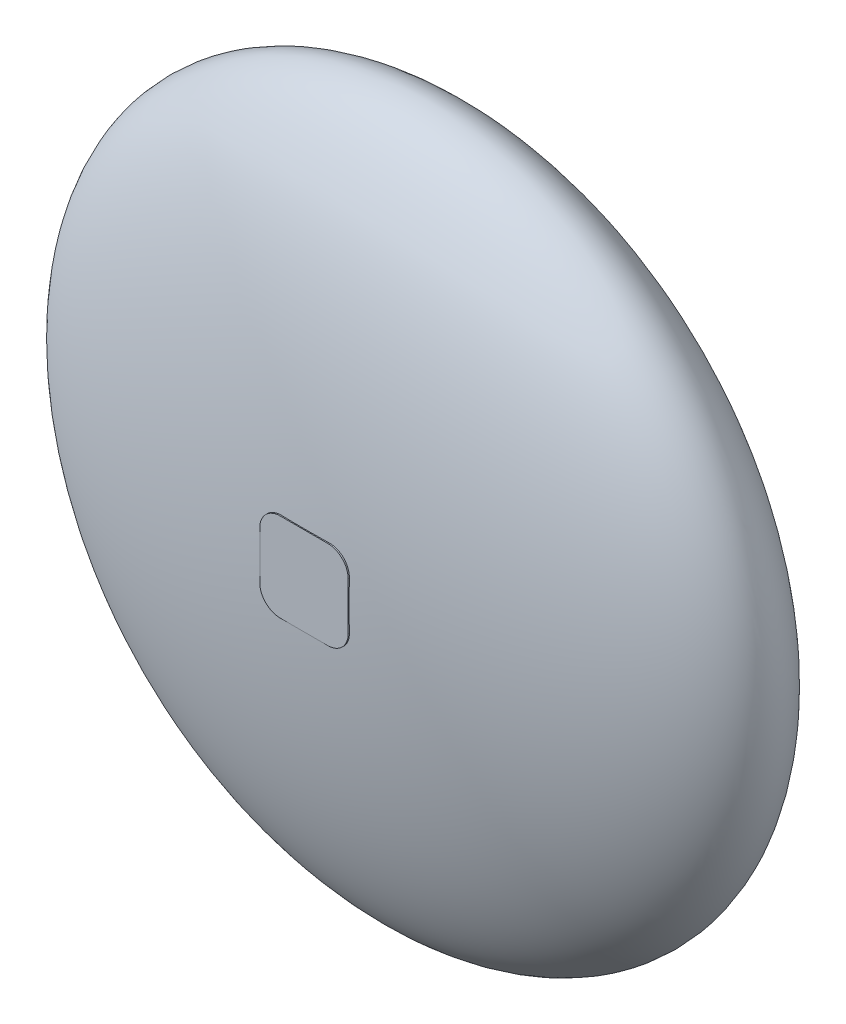
ISO-10303-21;
HEADER;
FILE_DESCRIPTION(('STEP AP214'),'2;1');
FILE_NAME('part.step','',(''),(''),'','','');
FILE_SCHEMA(('AUTOMOTIVE_DESIGN { 1 0 10303 214 1 1 1 1 }'));
ENDSEC;
DATA;
#1=APPLICATION_CONTEXT('core data for automotive mechanical design processes');
#2=APPLICATION_PROTOCOL_DEFINITION('international standard','automotive_design',2000,#1);
#3=PRODUCT_CONTEXT('',#1,'mechanical');
#4=PRODUCT('Part','Part','',(#3));
#5=PRODUCT_RELATED_PRODUCT_CATEGORY('part','',(#4));
#6=PRODUCT_DEFINITION_FORMATION('','',#4);
#7=PRODUCT_DEFINITION_CONTEXT('part definition',#1,'design');
#8=PRODUCT_DEFINITION('design','',#6,#7);
#9=PRODUCT_DEFINITION_SHAPE('','',#8);
#10=(LENGTH_UNIT() NAMED_UNIT(*) SI_UNIT(.MILLI.,.METRE.));
#11=(NAMED_UNIT(*) PLANE_ANGLE_UNIT() SI_UNIT($,.RADIAN.));
#12=(NAMED_UNIT(*) SI_UNIT($,.STERADIAN.) SOLID_ANGLE_UNIT());
#13=UNCERTAINTY_MEASURE_WITH_UNIT(LENGTH_MEASURE(1.E-05),#10,'distance_accuracy_value','');
#14=(GEOMETRIC_REPRESENTATION_CONTEXT(3) GLOBAL_UNCERTAINTY_ASSIGNED_CONTEXT((#13)) GLOBAL_UNIT_ASSIGNED_CONTEXT((#10,
#11,#12)) REPRESENTATION_CONTEXT('',''));
#15=CARTESIAN_POINT('',(0.,0.,0.));
#16=DIRECTION('',(0.,0.,1.));
#17=DIRECTION('',(1.,0.,0.));
#18=AXIS2_PLACEMENT_3D('',#15,#16,#17);
#19=CARTESIAN_POINT('',(0.,0.,0.));
#20=DIRECTION('',(0.,1.,0.));
#21=DIRECTION('',(-1.,0.,0.));
#22=AXIS2_PLACEMENT_3D('',#19,#20,#21);
#23=ELLIPSE('',#22,52.5,17.5);
#24=TRIMMED_CURVE('',#23,(PARAMETER_VALUE(1.5707963267949)),(PARAMETER_VALUE(4.71238898038469)),
.T.,.PARAMETER.);
#25=CARTESIAN_POINT('',(0.,0.,-17.5));
#26=DIRECTION('',(0.,0.,-1.));
#27=AXIS1_PLACEMENT('',#25,#26);
#28=SURFACE_OF_REVOLUTION('',#24,#27);
#29=CARTESIAN_POINT('',(0.,0.,-17.5));
#30=VERTEX_POINT('',#29);
#31=VERTEX_LOOP('',#30);
#32=FACE_BOUND('',#31,.T.);
#33=CARTESIAN_POINT('',(-6.5,6.5,17.2296578930375));
#34=CARTESIAN_POINT('',(-6.5,6.06673915113738,17.2478179504002));
#35=CARTESIAN_POINT('',(-6.5,5.63340143215986,17.2641388809829));
#36=CARTESIAN_POINT('',(-6.5,4.76672510889701,17.2931201536714));
#37=CARTESIAN_POINT('',(-6.5,4.33338653887092,17.3057815200269));
#38=CARTESIAN_POINT('',(-6.5,3.46670916694604,17.3274692129494));
#39=CARTESIAN_POINT('',(-6.5,3.03337038403128,17.3364962988253));
#40=CARTESIAN_POINT('',(-6.5,2.16669286962265,17.3509323271832));
#41=CARTESIAN_POINT('',(-6.5,1.73335414650458,17.3563417727258));
#42=CARTESIAN_POINT('',(-6.5,0.866676947528741,17.3635530016783));
#43=CARTESIAN_POINT('',(-6.5,0.433338473764371,17.3653550368415));
#44=CARTESIAN_POINT('',(-6.5,-0.433338473764368,17.3653550368415));
#45=CARTESIAN_POINT('',(-6.5,-0.866676947528738,17.3635530016783));
#46=CARTESIAN_POINT('',(-6.5,-1.73335414650458,17.3563417727258));
#47=CARTESIAN_POINT('',(-6.5,-2.16669286962265,17.3509323271832));
#48=CARTESIAN_POINT('',(-6.5,-3.03337038403128,17.3364962988253));
#49=CARTESIAN_POINT('',(-6.5,-3.46670916694603,17.3274692129494));
#50=CARTESIAN_POINT('',(-6.5,-4.33338653887092,17.3057815200269));
#51=CARTESIAN_POINT('',(-6.5,-4.76672510889701,17.2931201536714));
#52=CARTESIAN_POINT('',(-6.5,-5.63340143215985,17.2641388809829));
#53=CARTESIAN_POINT('',(-6.5,-6.06673915113738,17.2478179504002));
#54=CARTESIAN_POINT('',(-6.5,-6.49999999999999,17.2296578930375));
#55=B_SPLINE_CURVE_WITH_KNOTS('',3,(#33,#34,#35,#36,#37,#38,#39,#40,#41,#42,#43,#44,#45,#46,#47,
#48,#49,#50,#51,#52,#53,#54),.UNSPECIFIED.,.F.,.F.,(4,2,2,2,2,2,2,2,2,2,4),(0.,1.3009195823563,
2.60147470608828,3.90175796415447,5.20186037031147,6.50187204200393,7.80188371369638,
9.10198611985339,10.4022693779196,11.7028245016516,13.0037440840079),.UNSPECIFIED.);
#56=CARTESIAN_POINT('',(-6.5,3.5,17.326120294066));
#57=VERTEX_POINT('',#56);
#58=CARTESIAN_POINT('',(-6.5,-3.5,17.326120294066));
#59=VERTEX_POINT('',#58);
#60=EDGE_CURVE('E195',#57,#59,#55,.T.);
#61=ORIENTED_EDGE('',*,*,#60,.F.);
#62=CARTESIAN_POINT('',(-6.50000000000001,3.50000000000001,17.3261202940657));
#63=CARTESIAN_POINT('',(-6.50000808201307,3.58434884798788,17.3242268826554));
#64=CARTESIAN_POINT('',(-6.49644266273658,3.66869573952322,17.3224134129366));
#65=CARTESIAN_POINT('',(-6.4822264240845,3.83679011726138,17.3189584979342));
#66=CARTESIAN_POINT('',(-6.47157592798171,3.92053763063599,17.3173170448059));
#67=CARTESIAN_POINT('',(-6.44326163821618,4.08678385219233,17.3142192789836));
#68=CARTESIAN_POINT('',(-6.42560305528571,4.1692834410394,17.3127628297931));
#69=CARTESIAN_POINT('',(-6.38341504311973,4.33248509376793,17.3100443404612));
#70=CARTESIAN_POINT('',(-6.35888570223373,4.41318718074865,17.3087822978203));
#71=CARTESIAN_POINT('',(-6.27518790816895,4.65182008917852,17.3053010278226));
#72=CARTESIAN_POINT('',(-6.20589843033987,4.80634328802381,17.3033854347017));
#73=CARTESIAN_POINT('',(-6.04240542281534,5.1014577111456,17.3004270271699));
#74=CARTESIAN_POINT('',(-5.94820641467615,5.24205145752367,17.2993840545046));
#75=CARTESIAN_POINT('',(-5.73756561493316,5.50541975629821,17.2981987040124));
#76=CARTESIAN_POINT('',(-5.62113020388941,5.62819940256874,17.2980560682398));
#77=CARTESIAN_POINT('',(-5.36928193836722,5.85249372873365,17.2986755149767));
#78=CARTESIAN_POINT('',(-5.23386540750456,5.9540042795691,17.299437772966));
#79=CARTESIAN_POINT('',(-4.94792670797271,6.13286105532747,17.3018447910835));
#80=CARTESIAN_POINT('',(-4.79740346105683,6.21020555376777,17.3034896142415));
#81=CARTESIAN_POINT('',(-4.4855520591393,6.33849827075239,17.3076145274679));
#82=CARTESIAN_POINT('',(-4.32423020689434,6.38946173783651,17.3100941336511));
#83=CARTESIAN_POINT('',(-4.05160835155083,6.45094454681752,17.3148368024317));
#84=CARTESIAN_POINT('',(-3.94201367352901,6.46932964167806,17.3168852743214));
#85=CARTESIAN_POINT('',(-3.72162682968406,6.49385585453891,17.3212831979293));
#86=CARTESIAN_POINT('',(-3.61083658716706,6.50001433715969,17.3236322177419));
#87=CARTESIAN_POINT('',(-3.5,6.5,17.326120294066));
#88=B_SPLINE_CURVE_WITH_KNOTS('',3,(#62,#63,#64,#65,#66,#67,#68,#69,#70,#71,#72,#73,#74,#75,#76,
#77,#78,#79,#80,#81,#82,#83,#84,#85,#86,#87),.UNSPECIFIED.,.F.,.F.,(4,2,2,2,2,2,2,2,2,2,2,2,4),
(0.,0.25302815046839,0.506044756740944,0.758873588634506,1.01169916960884,1.51715276012559,
2.0225146640521,2.52773177566137,3.033046876503,3.53839807005597,4.04345683771944,
4.37625598085183,4.70858213305575),.UNSPECIFIED.);
#89=CARTESIAN_POINT('',(-3.5,6.5,17.326120294066));
#90=VERTEX_POINT('',#89);
#91=EDGE_CURVE('E60',#57,#90,#88,.T.);
#92=ORIENTED_EDGE('',*,*,#91,.T.);
#93=CARTESIAN_POINT('',(6.50000000000002,6.50000000000001,17.2296578930375));
#94=CARTESIAN_POINT('',(6.0667391511374,6.50000000000001,17.2478179504002));
#95=CARTESIAN_POINT('',(5.63340143215988,6.5,17.2641388809829));
#96=CARTESIAN_POINT('',(4.76672510889703,6.5,17.2931201536714));
#97=CARTESIAN_POINT('',(4.33338653887094,6.5,17.3057815200269));
#98=CARTESIAN_POINT('',(3.46670916694605,6.5,17.3274692129494));
#99=CARTESIAN_POINT('',(3.0333703840313,6.5,17.3364962988253));
#100=CARTESIAN_POINT('',(2.16669286962266,6.5,17.3509323271832));
#101=CARTESIAN_POINT('',(1.73335414650459,6.5,17.3563417727258));
#102=CARTESIAN_POINT('',(0.86667694752875,6.5,17.3635530016783));
#103=CARTESIAN_POINT('',(0.43333847376438,6.5,17.3653550368415));
#104=CARTESIAN_POINT('',(-0.433338473764362,6.5,17.3653550368415));
#105=CARTESIAN_POINT('',(-0.866676947528733,6.5,17.3635530016783));
#106=CARTESIAN_POINT('',(-1.73335414650457,6.5,17.3563417727258));
#107=CARTESIAN_POINT('',(-2.16669286962264,6.5,17.3509323271832));
#108=CARTESIAN_POINT('',(-3.03337038403128,6.5,17.3364962988253));
#109=CARTESIAN_POINT('',(-3.46670916694603,6.5,17.3274692129494));
#110=CARTESIAN_POINT('',(-4.33338653887092,6.5,17.3057815200269));
#111=CARTESIAN_POINT('',(-4.76672510889701,6.5,17.2931201536714));
#112=CARTESIAN_POINT('',(-5.63340143215986,6.5,17.2641388809829));
#113=CARTESIAN_POINT('',(-6.06673915113739,6.5,17.2478179504002));
#114=CARTESIAN_POINT('',(-6.5,6.5,17.2296578930375));
#115=B_SPLINE_CURVE_WITH_KNOTS('',3,(#93,#94,#95,#96,#97,#98,#99,#100,#101,#102,#103,#104,#105,
#106,#107,#108,#109,#110,#111,#112,#113,#114),.UNSPECIFIED.,.F.,.F.,(4,2,2,2,2,2,2,2,2,2,4),(0.,
1.3009195823563,2.60147470608829,3.90175796415448,5.20186037031149,6.50187204200394,
7.8018837136964,9.10198611985341,10.4022693779196,11.7028245016516,13.0037440840079),.UNSPECIFIED.);
#116=CARTESIAN_POINT('',(3.5,6.50000000000001,17.326120294066));
#117=VERTEX_POINT('',#116);
#118=EDGE_CURVE('E188',#117,#90,#115,.T.);
#119=ORIENTED_EDGE('',*,*,#118,.F.);
#120=CARTESIAN_POINT('',(3.5,6.5,17.326120294066));
#121=CARTESIAN_POINT('',(3.58434884798787,6.50000808201306,17.3242268826554));
#122=CARTESIAN_POINT('',(3.66869573952321,6.49644266273658,17.3224134129366));
#123=CARTESIAN_POINT('',(3.83679011726137,6.4822264240845,17.3189584979342));
#124=CARTESIAN_POINT('',(3.92053763063598,6.47157592798172,17.3173170448059));
#125=CARTESIAN_POINT('',(4.08678385219233,6.44326163821618,17.3142192789837));
#126=CARTESIAN_POINT('',(4.1692834410394,6.42560305528572,17.3127628297931));
#127=CARTESIAN_POINT('',(4.33248509376792,6.38341504311973,17.3100443404612));
#128=CARTESIAN_POINT('',(4.41318718074864,6.35888570223374,17.3087822978203));
#129=CARTESIAN_POINT('',(4.65182008917851,6.27518790816896,17.3053010278226));
#130=CARTESIAN_POINT('',(4.80634328802381,6.20589843033988,17.3033854347017));
#131=CARTESIAN_POINT('',(5.10145771114559,6.04240542281534,17.3004270271699));
#132=CARTESIAN_POINT('',(5.24205145752366,5.94820641467615,17.2993840545046));
#133=CARTESIAN_POINT('',(5.5054197562982,5.73756561493316,17.2981987040124));
#134=CARTESIAN_POINT('',(5.62819940256874,5.62113020388942,17.2980560682398));
#135=CARTESIAN_POINT('',(5.85249372873364,5.36928193836722,17.2986755149767));
#136=CARTESIAN_POINT('',(5.9540042795691,5.23386540750456,17.299437772966));
#137=CARTESIAN_POINT('',(6.13286105532746,4.94792670797271,17.3018447910835));
#138=CARTESIAN_POINT('',(6.21020555376777,4.79740346105683,17.3034896142415));
#139=CARTESIAN_POINT('',(6.33849827075238,4.48555205913931,17.3076145274679));
#140=CARTESIAN_POINT('',(6.3894617378365,4.32423020689434,17.3100941336511));
#141=CARTESIAN_POINT('',(6.45094454681752,4.05160835155083,17.3148368024317));
#142=CARTESIAN_POINT('',(6.46932964167805,3.94201367352902,17.3168852743215));
#143=CARTESIAN_POINT('',(6.49385585453891,3.72162682968407,17.3212831979293));
#144=CARTESIAN_POINT('',(6.50001433715969,3.61083658716707,17.3236322177419));
#145=CARTESIAN_POINT('',(6.5,3.50000000000001,17.326120294066));
#146=B_SPLINE_CURVE_WITH_KNOTS('',3,(#120,#121,#122,#123,#124,#125,#126,#127,#128,#129,#130,
#131,#132,#133,#134,#135,#136,#137,#138,#139,#140,#141,#142,#143,#144,#145),.UNSPECIFIED.,.F.,
.F.,(4,2,2,2,2,2,2,2,2,2,2,2,4),(0.,0.253028150468392,0.506044756740949,0.758873588634511,
1.01169916960885,1.51715276012559,2.02251466405211,2.52773177566137,3.03304687650301,
3.53839807005598,4.04345683771945,4.37625598085184,4.70858213305576),.UNSPECIFIED.);
#147=CARTESIAN_POINT('',(6.5,3.50000000000001,17.326120294066));
#148=VERTEX_POINT('',#147);
#149=EDGE_CURVE('E53',#117,#148,#146,.T.);
#150=ORIENTED_EDGE('',*,*,#149,.T.);
#151=CARTESIAN_POINT('',(6.50000000000001,-6.50000000000002,17.2296578930375));
#152=CARTESIAN_POINT('',(6.5,-6.0667391511374,17.2478179504002));
#153=CARTESIAN_POINT('',(6.5,-5.63340143215988,17.2641388809829));
#154=CARTESIAN_POINT('',(6.5,-4.76672510889703,17.2931201536714));
#155=CARTESIAN_POINT('',(6.5,-4.33338653887094,17.3057815200269));
#156=CARTESIAN_POINT('',(6.5,-3.46670916694605,17.3274692129494));
#157=CARTESIAN_POINT('',(6.5,-3.0333703840313,17.3364962988253));
#158=CARTESIAN_POINT('',(6.5,-2.16669286962266,17.3509323271832));
#159=CARTESIAN_POINT('',(6.5,-1.73335414650459,17.3563417727258));
#160=CARTESIAN_POINT('',(6.5,-0.866676947528749,17.3635530016783));
#161=CARTESIAN_POINT('',(6.5,-0.433338473764379,17.3653550368415));
#162=CARTESIAN_POINT('',(6.5,0.433338473764363,17.3653550368415));
#163=CARTESIAN_POINT('',(6.5,0.866676947528734,17.3635530016783));
#164=CARTESIAN_POINT('',(6.5,1.73335414650457,17.3563417727258));
#165=CARTESIAN_POINT('',(6.5,2.16669286962264,17.3509323271832));
#166=CARTESIAN_POINT('',(6.5,3.03337038403128,17.3364962988253));
#167=CARTESIAN_POINT('',(6.5,3.46670916694604,17.3274692129494));
#168=CARTESIAN_POINT('',(6.5,4.33338653887092,17.3057815200269));
#169=CARTESIAN_POINT('',(6.5,4.76672510889701,17.2931201536714));
#170=CARTESIAN_POINT('',(6.5,5.63340143215986,17.2641388809829));
#171=CARTESIAN_POINT('',(6.5,6.06673915113739,17.2478179504002));
#172=CARTESIAN_POINT('',(6.5,6.5,17.2296578930375));
#173=B_SPLINE_CURVE_WITH_KNOTS('',3,(#151,#152,#153,#154,#155,#156,#157,#158,#159,#160,#161,
#162,#163,#164,#165,#166,#167,#168,#169,#170,#171,#172),.UNSPECIFIED.,.F.,.F.,(4,2,2,2,2,2,2,2,
2,2,4),(0.,1.3009195823563,2.60147470608829,3.90175796415448,5.20186037031149,6.50187204200394,
7.8018837136964,9.10198611985341,10.4022693779196,11.7028245016516,13.0037440840079),.UNSPECIFIED.);
#174=CARTESIAN_POINT('',(6.5,-3.49999999999999,17.326120294066));
#175=VERTEX_POINT('',#174);
#176=EDGE_CURVE('E187',#175,#148,#173,.T.);
#177=ORIENTED_EDGE('',*,*,#176,.F.);
#178=CARTESIAN_POINT('',(6.5,-3.5,17.326120294066));
#179=CARTESIAN_POINT('',(6.50000808201306,-3.58434884798787,17.3242268826554));
#180=CARTESIAN_POINT('',(6.49644266273658,-3.66869573952321,17.3224134129366));
#181=CARTESIAN_POINT('',(6.4822264240845,-3.83679011726137,17.3189584979342));
#182=CARTESIAN_POINT('',(6.47157592798171,-3.92053763063598,17.3173170448059));
#183=CARTESIAN_POINT('',(6.44326163821618,-4.08678385219233,17.3142192789837));
#184=CARTESIAN_POINT('',(6.42560305528571,-4.16928344103939,17.3127628297931));
#185=CARTESIAN_POINT('',(6.38341504311973,-4.33248509376792,17.3100443404612));
#186=CARTESIAN_POINT('',(6.35888570223373,-4.41318718074864,17.3087822978203));
#187=CARTESIAN_POINT('',(6.27518790816896,-4.65182008917851,17.3053010278226));
#188=CARTESIAN_POINT('',(6.20589843033988,-4.80634328802381,17.3033854347017));
#189=CARTESIAN_POINT('',(6.04240542281534,-5.10145771114559,17.3004270271699));
#190=CARTESIAN_POINT('',(5.94820641467615,-5.24205145752366,17.2993840545046));
#191=CARTESIAN_POINT('',(5.73756561493316,-5.5054197562982,17.2981987040124));
#192=CARTESIAN_POINT('',(5.62113020388941,-5.62819940256874,17.2980560682398));
#193=CARTESIAN_POINT('',(5.36928193836722,-5.85249372873364,17.2986755149767));
#194=CARTESIAN_POINT('',(5.23386540750456,-5.9540042795691,17.299437772966));
#195=CARTESIAN_POINT('',(4.9479267079727,-6.13286105532746,17.3018447910835));
#196=CARTESIAN_POINT('',(4.79740346105683,-6.21020555376777,17.3034896142415));
#197=CARTESIAN_POINT('',(4.4855520591393,-6.33849827075238,17.3076145274679));
#198=CARTESIAN_POINT('',(4.32423020689434,-6.3894617378365,17.3100941336511));
#199=CARTESIAN_POINT('',(4.05160835155082,-6.45094454681752,17.3148368024317));
#200=CARTESIAN_POINT('',(3.94201367352901,-6.46932964167805,17.3168852743215));
#201=CARTESIAN_POINT('',(3.72162682968406,-6.4938558545389,17.3212831979293));
#202=CARTESIAN_POINT('',(3.61083658716706,-6.50001433715969,17.3236322177419));
#203=CARTESIAN_POINT('',(3.5,-6.5,17.326120294066));
#204=B_SPLINE_CURVE_WITH_KNOTS('',3,(#178,#179,#180,#181,#182,#183,#184,#185,#186,#187,#188,
#189,#190,#191,#192,#193,#194,#195,#196,#197,#198,#199,#200,#201,#202,#203),.UNSPECIFIED.,.F.,
.F.,(4,2,2,2,2,2,2,2,2,2,2,2,4),(0.,0.253028150468392,0.50604475674095,0.758873588634512,
1.01169916960885,1.51715276012559,2.02251466405211,2.52773177566137,3.03304687650301,
3.53839807005598,4.04345683771945,4.37625598085184,4.70858213305576),.UNSPECIFIED.);
#205=CARTESIAN_POINT('',(3.5,-6.5,17.326120294066));
#206=VERTEX_POINT('',#205);
#207=EDGE_CURVE('E157',#175,#206,#204,.T.);
#208=ORIENTED_EDGE('',*,*,#207,.T.);
#209=CARTESIAN_POINT('',(-6.5,-6.5,17.2296578930375));
#210=CARTESIAN_POINT('',(-6.06673915113738,-6.5,17.2478179504002));
#211=CARTESIAN_POINT('',(-5.63340143215985,-6.5,17.2641388809829));
#212=CARTESIAN_POINT('',(-4.76672510889701,-6.5,17.2931201536714));
#213=CARTESIAN_POINT('',(-4.33338653887092,-6.5,17.3057815200269));
#214=CARTESIAN_POINT('',(-3.46670916694603,-6.5,17.3274692129494));
#215=CARTESIAN_POINT('',(-3.03337038403128,-6.5,17.3364962988253));
#216=CARTESIAN_POINT('',(-2.16669286962264,-6.5,17.3509323271832));
#217=CARTESIAN_POINT('',(-1.73335414650457,-6.5,17.3563417727258));
#218=CARTESIAN_POINT('',(-0.86667694752873,-6.5,17.3635530016783));
#219=CARTESIAN_POINT('',(-0.433338473764359,-6.5,17.3653550368415));
#220=CARTESIAN_POINT('',(0.433338473764382,-6.5,17.3653550368415));
#221=CARTESIAN_POINT('',(0.866676947528753,-6.5,17.3635530016783));
#222=CARTESIAN_POINT('',(1.73335414650459,-6.5,17.3563417727258));
#223=CARTESIAN_POINT('',(2.16669286962266,-6.5,17.3509323271832));
#224=CARTESIAN_POINT('',(3.0333703840313,-6.5,17.3364962988253));
#225=CARTESIAN_POINT('',(3.46670916694605,-6.5,17.3274692129494));
#226=CARTESIAN_POINT('',(4.33338653887094,-6.5,17.3057815200269));
#227=CARTESIAN_POINT('',(4.76672510889703,-6.5,17.2931201536714));
#228=CARTESIAN_POINT('',(5.63340143215988,-6.5,17.2641388809829));
#229=CARTESIAN_POINT('',(6.0667391511374,-6.5,17.2478179504002));
#230=CARTESIAN_POINT('',(6.50000000000002,-6.5,17.2296578930375));
#231=B_SPLINE_CURVE_WITH_KNOTS('',3,(#209,#210,#211,#212,#213,#214,#215,#216,#217,#218,#219,
#220,#221,#222,#223,#224,#225,#226,#227,#228,#229,#230),.UNSPECIFIED.,.F.,.F.,(4,2,2,2,2,2,2,2,
2,2,4),(0.,1.3009195823563,2.60147470608829,3.90175796415447,5.20186037031149,6.50187204200394,
7.80188371369639,9.1019861198534,10.4022693779196,11.7028245016516,13.0037440840079),.UNSPECIFIED.);
#232=CARTESIAN_POINT('',(-3.5,-6.5,17.326120294066));
#233=VERTEX_POINT('',#232);
#234=EDGE_CURVE('E192',#233,#206,#231,.T.);
#235=ORIENTED_EDGE('',*,*,#234,.F.);
#236=CARTESIAN_POINT('',(-3.5,-6.5,17.326120294066));
#237=CARTESIAN_POINT('',(-3.58434884798787,-6.50000808201306,17.3242268826554));
#238=CARTESIAN_POINT('',(-3.66869573952321,-6.49644266273658,17.3224134129366));
#239=CARTESIAN_POINT('',(-3.83679011726137,-6.4822264240845,17.3189584979342));
#240=CARTESIAN_POINT('',(-3.92053763063598,-6.47157592798171,17.3173170448059));
#241=CARTESIAN_POINT('',(-4.08678385219232,-6.44326163821618,17.3142192789836));
#242=CARTESIAN_POINT('',(-4.16928344103939,-6.42560305528571,17.3127628297931));
#243=CARTESIAN_POINT('',(-4.33248509376792,-6.38341504311973,17.3100443404612));
#244=CARTESIAN_POINT('',(-4.41318718074864,-6.35888570223373,17.3087822978203));
#245=CARTESIAN_POINT('',(-4.65182008917851,-6.27518790816896,17.3053010278226));
#246=CARTESIAN_POINT('',(-4.8063432880238,-6.20589843033988,17.3033854347017));
#247=CARTESIAN_POINT('',(-5.10145771114559,-6.04240542281534,17.3004270271699));
#248=CARTESIAN_POINT('',(-5.24205145752366,-5.94820641467616,17.2993840545046));
#249=CARTESIAN_POINT('',(-5.5054197562982,-5.73756561493316,17.2981987040124));
#250=CARTESIAN_POINT('',(-5.62819940256873,-5.62113020388942,17.2980560682398));
#251=CARTESIAN_POINT('',(-5.85249372873364,-5.36928193836722,17.2986755149767));
#252=CARTESIAN_POINT('',(-5.9540042795691,-5.23386540750457,17.299437772966));
#253=CARTESIAN_POINT('',(-6.13286105532747,-4.94792670797271,17.3018447910835));
#254=CARTESIAN_POINT('',(-6.21020555376777,-4.79740346105683,17.3034896142415));
#255=CARTESIAN_POINT('',(-6.33849827075238,-4.4855520591393,17.3076145274679));
#256=CARTESIAN_POINT('',(-6.38946173783651,-4.32423020689434,17.3100941336511));
#257=CARTESIAN_POINT('',(-6.45094454681752,-4.05160835155083,17.3148368024317));
#258=CARTESIAN_POINT('',(-6.46932964167806,-3.94201367352902,17.3168852743214));
#259=CARTESIAN_POINT('',(-6.4938558545389,-3.72162682968406,17.3212831979293));
#260=CARTESIAN_POINT('',(-6.50001433715969,-3.61083658716706,17.3236322177419));
#261=CARTESIAN_POINT('',(-6.5,-3.5,17.326120294066));
#262=B_SPLINE_CURVE_WITH_KNOTS('',3,(#236,#237,#238,#239,#240,#241,#242,#243,#244,#245,#246,
#247,#248,#249,#250,#251,#252,#253,#254,#255,#256,#257,#258,#259,#260,#261),.UNSPECIFIED.,.F.,
.F.,(4,2,2,2,2,2,2,2,2,2,2,2,4),(0.,0.25302815046839,0.506044756740947,0.758873588634509,
1.01169916960885,1.51715276012559,2.0225146640521,2.52773177566137,3.03304687650301,
3.53839807005598,4.04345683771944,4.37625598085184,4.70858213305577),.UNSPECIFIED.);
#263=EDGE_CURVE('E11',#233,#59,#262,.T.);
#264=ORIENTED_EDGE('',*,*,#263,.T.);
#265=EDGE_LOOP('',(#61,#92,#119,#150,#177,#208,#235,#264));
#266=FACE_BOUND('',#265,.T.);
#267=ADVANCED_FACE('F39',(#32,#266),#28,.T.);
#268=CARTESIAN_POINT('',(-6.5,-6.5,17.5));
#269=DIRECTION('',(1.,0.,0.));
#270=DIRECTION('',(0.,0.,-1.));
#271=AXIS2_PLACEMENT_3D('',#268,#269,#270);
#272=PLANE('',#271);
#273=DIRECTION('',(0.,-1.,0.));
#274=VECTOR('',#273,1.);
#275=CARTESIAN_POINT('',(-6.5,-6.5,17.5));
#276=LINE('',#275,#274);
#277=CARTESIAN_POINT('',(-6.5,3.5,17.5));
#278=VERTEX_POINT('',#277);
#279=CARTESIAN_POINT('',(-6.5,-3.5,17.5));
#280=VERTEX_POINT('',#279);
#281=EDGE_CURVE('E134',#278,#280,#276,.T.);
#282=ORIENTED_EDGE('',*,*,#281,.F.);
#283=DIRECTION('',(0.,0.,-1.));
#284=VECTOR('',#283,1.);
#285=CARTESIAN_POINT('',(-6.5,3.5,17.5));
#286=LINE('',#285,#284);
#287=EDGE_CURVE('E145',#278,#57,#286,.T.);
#288=ORIENTED_EDGE('',*,*,#287,.T.);
#289=ORIENTED_EDGE('',*,*,#60,.T.);
#290=DIRECTION('',(0.,0.,-1.));
#291=VECTOR('',#290,1.);
#292=CARTESIAN_POINT('',(-6.5,-3.5,17.5));
#293=LINE('',#292,#291);
#294=EDGE_CURVE('E142',#59,#280,#293,.F.);
#295=ORIENTED_EDGE('',*,*,#294,.T.);
#296=EDGE_LOOP('',(#282,#288,#289,#295));
#297=FACE_BOUND('',#296,.T.);
#298=ADVANCED_FACE('F238',(#297),#272,.F.);
#299=CARTESIAN_POINT('',(6.5,-6.5,17.5));
#300=DIRECTION('',(0.,1.,0.));
#301=DIRECTION('',(-1.,0.,0.));
#302=AXIS2_PLACEMENT_3D('',#299,#300,#301);
#303=PLANE('',#302);
#304=ORIENTED_EDGE('',*,*,#234,.T.);
#305=DIRECTION('',(0.,0.,-1.));
#306=VECTOR('',#305,1.);
#307=CARTESIAN_POINT('',(3.5,-6.5,17.5));
#308=LINE('',#307,#306);
#309=CARTESIAN_POINT('',(3.5,-6.5,17.5));
#310=VERTEX_POINT('',#309);
#311=EDGE_CURVE('E139',#206,#310,#308,.F.);
#312=ORIENTED_EDGE('',*,*,#311,.T.);
#313=DIRECTION('',(1.,0.,0.));
#314=VECTOR('',#313,1.);
#315=CARTESIAN_POINT('',(6.5,-6.5,17.5));
#316=LINE('',#315,#314);
#317=CARTESIAN_POINT('',(-3.5,-6.5,17.5));
#318=VERTEX_POINT('',#317);
#319=EDGE_CURVE('E122',#318,#310,#316,.T.);
#320=ORIENTED_EDGE('',*,*,#319,.F.);
#321=DIRECTION('',(0.,0.,-1.));
#322=VECTOR('',#321,1.);
#323=CARTESIAN_POINT('',(-3.5,-6.5,17.5));
#324=LINE('',#323,#322);
#325=EDGE_CURVE('E197',#318,#233,#324,.T.);
#326=ORIENTED_EDGE('',*,*,#325,.T.);
#327=EDGE_LOOP('',(#304,#312,#320,#326));
#328=FACE_BOUND('',#327,.T.);
#329=ADVANCED_FACE('F235',(#328),#303,.F.);
#330=CARTESIAN_POINT('',(6.5,-6.5,17.5));
#331=DIRECTION('',(-1.,0.,0.));
#332=DIRECTION('',(0.,0.,1.));
#333=AXIS2_PLACEMENT_3D('',#330,#331,#332);
#334=PLANE('',#333);
#335=DIRECTION('',(0.,1.,0.));
#336=VECTOR('',#335,1.);
#337=CARTESIAN_POINT('',(6.5,-6.5,17.5));
#338=LINE('',#337,#336);
#339=CARTESIAN_POINT('',(6.5,-3.5,17.5));
#340=VERTEX_POINT('',#339);
#341=CARTESIAN_POINT('',(6.5,3.5,17.5));
#342=VERTEX_POINT('',#341);
#343=EDGE_CURVE('E133',#340,#342,#338,.T.);
#344=ORIENTED_EDGE('',*,*,#343,.F.);
#345=DIRECTION('',(0.,0.,-1.));
#346=VECTOR('',#345,1.);
#347=CARTESIAN_POINT('',(6.5,-3.5,17.5));
#348=LINE('',#347,#346);
#349=EDGE_CURVE('E141',#340,#175,#348,.T.);
#350=ORIENTED_EDGE('',*,*,#349,.T.);
#351=ORIENTED_EDGE('',*,*,#176,.T.);
#352=DIRECTION('',(0.,0.,-1.));
#353=VECTOR('',#352,1.);
#354=CARTESIAN_POINT('',(6.5,3.5,17.5));
#355=LINE('',#354,#353);
#356=EDGE_CURVE('E191',#148,#342,#355,.F.);
#357=ORIENTED_EDGE('',*,*,#356,.T.);
#358=EDGE_LOOP('',(#344,#350,#351,#357));
#359=FACE_BOUND('',#358,.T.);
#360=ADVANCED_FACE('F190',(#359),#334,.F.);
#361=CARTESIAN_POINT('',(6.5,6.5,17.5));
#362=DIRECTION('',(0.,-1.,0.));
#363=DIRECTION('',(1.,0.,0.));
#364=AXIS2_PLACEMENT_3D('',#361,#362,#363);
#365=PLANE('',#364);
#366=ORIENTED_EDGE('',*,*,#118,.T.);
#367=DIRECTION('',(0.,0.,-1.));
#368=VECTOR('',#367,1.);
#369=CARTESIAN_POINT('',(-3.5,6.5,17.5));
#370=LINE('',#369,#368);
#371=CARTESIAN_POINT('',(-3.5,6.5,17.5));
#372=VERTEX_POINT('',#371);
#373=EDGE_CURVE('E155',#90,#372,#370,.F.);
#374=ORIENTED_EDGE('',*,*,#373,.T.);
#375=DIRECTION('',(-1.,0.,0.));
#376=VECTOR('',#375,1.);
#377=CARTESIAN_POINT('',(6.5,6.5,17.5));
#378=LINE('',#377,#376);
#379=CARTESIAN_POINT('',(3.5,6.5,17.5));
#380=VERTEX_POINT('',#379);
#381=EDGE_CURVE('E211',#380,#372,#378,.T.);
#382=ORIENTED_EDGE('',*,*,#381,.F.);
#383=DIRECTION('',(0.,0.,-1.));
#384=VECTOR('',#383,1.);
#385=CARTESIAN_POINT('',(3.5,6.5,17.5));
#386=LINE('',#385,#384);
#387=EDGE_CURVE('E153',#380,#117,#386,.T.);
#388=ORIENTED_EDGE('',*,*,#387,.T.);
#389=EDGE_LOOP('',(#366,#374,#382,#388));
#390=FACE_BOUND('',#389,.T.);
#391=ADVANCED_FACE('F118',(#390),#365,.F.);
#392=CARTESIAN_POINT('',(0.,0.,17.5));
#393=DIRECTION('',(0.,0.,1.));
#394=DIRECTION('',(1.,0.,0.));
#395=AXIS2_PLACEMENT_3D('',#392,#393,#394);
#396=PLANE('',#395);
#397=CARTESIAN_POINT('',(0.,0.,17.5));
#398=VERTEX_POINT('',#397);
#399=VERTEX_LOOP('',#398);
#400=FACE_BOUND('',#399,.T.);
#401=ORIENTED_EDGE('',*,*,#319,.T.);
#402=CARTESIAN_POINT('',(3.5,-3.5,17.5));
#403=DIRECTION('',(0.,0.,1.));
#404=DIRECTION('',(1.,0.,0.));
#405=AXIS2_PLACEMENT_3D('',#402,#403,#404);
#406=CIRCLE('',#405,3.);
#407=EDGE_CURVE('E125',#310,#340,#406,.T.);
#408=ORIENTED_EDGE('',*,*,#407,.T.);
#409=ORIENTED_EDGE('',*,*,#343,.T.);
#410=CARTESIAN_POINT('',(3.5,3.5,17.5));
#411=DIRECTION('',(0.,0.,1.));
#412=DIRECTION('',(1.,0.,0.));
#413=AXIS2_PLACEMENT_3D('',#410,#411,#412);
#414=CIRCLE('',#413,3.);
#415=EDGE_CURVE('E147',#342,#380,#414,.T.);
#416=ORIENTED_EDGE('',*,*,#415,.T.);
#417=ORIENTED_EDGE('',*,*,#381,.T.);
#418=CARTESIAN_POINT('',(-3.5,3.5,17.5));
#419=DIRECTION('',(0.,0.,1.));
#420=DIRECTION('',(1.,0.,0.));
#421=AXIS2_PLACEMENT_3D('',#418,#419,#420);
#422=CIRCLE('',#421,3.);
#423=EDGE_CURVE('E143',#372,#278,#422,.T.);
#424=ORIENTED_EDGE('',*,*,#423,.T.);
#425=ORIENTED_EDGE('',*,*,#281,.T.);
#426=CARTESIAN_POINT('',(-3.5,-3.5,17.5));
#427=DIRECTION('',(0.,0.,1.));
#428=DIRECTION('',(1.,0.,0.));
#429=AXIS2_PLACEMENT_3D('',#426,#427,#428);
#430=CIRCLE('',#429,3.);
#431=EDGE_CURVE('E129',#280,#318,#430,.T.);
#432=ORIENTED_EDGE('',*,*,#431,.T.);
#433=EDGE_LOOP('',(#401,#408,#409,#416,#417,#424,#425,#432));
#434=FACE_BOUND('',#433,.T.);
#435=ADVANCED_FACE('F114',(#400,#434),#396,.T.);
#436=CARTESIAN_POINT('',(3.5,-3.5,17.5));
#437=DIRECTION('',(0.,0.,-1.));
#438=DIRECTION('',(-1.,0.,0.));
#439=AXIS2_PLACEMENT_3D('',#436,#437,#438);
#440=CYLINDRICAL_SURFACE('',#439,3.);
#441=ORIENTED_EDGE('',*,*,#407,.F.);
#442=ORIENTED_EDGE('',*,*,#311,.F.);
#443=ORIENTED_EDGE('',*,*,#207,.F.);
#444=ORIENTED_EDGE('',*,*,#349,.F.);
#445=EDGE_LOOP('',(#441,#442,#443,#444));
#446=FACE_BOUND('',#445,.T.);
#447=ADVANCED_FACE('F117',(#446),#440,.T.);
#448=CARTESIAN_POINT('',(-3.5,3.5,17.5));
#449=DIRECTION('',(0.,0.,-1.));
#450=DIRECTION('',(-1.,0.,0.));
#451=AXIS2_PLACEMENT_3D('',#448,#449,#450);
#452=CYLINDRICAL_SURFACE('',#451,3.);
#453=ORIENTED_EDGE('',*,*,#423,.F.);
#454=ORIENTED_EDGE('',*,*,#373,.F.);
#455=ORIENTED_EDGE('',*,*,#91,.F.);
#456=ORIENTED_EDGE('',*,*,#287,.F.);
#457=EDGE_LOOP('',(#453,#454,#455,#456));
#458=FACE_BOUND('',#457,.T.);
#459=ADVANCED_FACE('F174',(#458),#452,.T.);
#460=CARTESIAN_POINT('',(3.5,3.5,17.5));
#461=DIRECTION('',(0.,0.,-1.));
#462=DIRECTION('',(-1.,0.,0.));
#463=AXIS2_PLACEMENT_3D('',#460,#461,#462);
#464=CYLINDRICAL_SURFACE('',#463,3.);
#465=ORIENTED_EDGE('',*,*,#415,.F.);
#466=ORIENTED_EDGE('',*,*,#356,.F.);
#467=ORIENTED_EDGE('',*,*,#149,.F.);
#468=ORIENTED_EDGE('',*,*,#387,.F.);
#469=EDGE_LOOP('',(#465,#466,#467,#468));
#470=FACE_BOUND('',#469,.T.);
#471=ADVANCED_FACE('F177',(#470),#464,.T.);
#472=CARTESIAN_POINT('',(-3.5,-3.5,17.5));
#473=DIRECTION('',(0.,0.,-1.));
#474=DIRECTION('',(-1.,0.,0.));
#475=AXIS2_PLACEMENT_3D('',#472,#473,#474);
#476=CYLINDRICAL_SURFACE('',#475,3.);
#477=ORIENTED_EDGE('',*,*,#431,.F.);
#478=ORIENTED_EDGE('',*,*,#294,.F.);
#479=ORIENTED_EDGE('',*,*,#263,.F.);
#480=ORIENTED_EDGE('',*,*,#325,.F.);
#481=EDGE_LOOP('',(#477,#478,#479,#480));
#482=FACE_BOUND('',#481,.T.);
#483=ADVANCED_FACE('F41',(#482),#476,.T.);
#484=CLOSED_SHELL('',(#267,#298,#329,#360,#391,#435,#447,#459,#471,#483));
#485=CARTESIAN_POINT('',(6.07437234764756,-12.6135641506335,-8.));
#486=DIRECTION('',(0.,0.,1.));
#487=DIRECTION('',(1.,0.,0.));
#488=AXIS2_PLACEMENT_3D('',#485,#486,#487);
#489=CYLINDRICAL_SURFACE('',#488,4.6);
#490=CARTESIAN_POINT('',(6.07437234764756,-12.6135641506335,-8.));
#491=DIRECTION('',(0.,0.,1.));
#492=DIRECTION('',(1.,0.,0.));
#493=AXIS2_PLACEMENT_3D('',#490,#491,#492);
#494=CIRCLE('',#493,4.6);
#495=CARTESIAN_POINT('',(10.6743723476476,-12.6135641506335,-8.));
#496=VERTEX_POINT('',#495);
#497=EDGE_CURVE('E585',#496,#496,#494,.T.);
#498=ORIENTED_EDGE('',*,*,#497,.F.);
#499=EDGE_LOOP('',(#498));
#500=FACE_BOUND('',#499,.T.);
#501=CARTESIAN_POINT('',(6.07437234764756,-12.6135641506335,8.));
#502=DIRECTION('',(0.,0.,1.));
#503=DIRECTION('',(1.,0.,0.));
#504=AXIS2_PLACEMENT_3D('',#501,#502,#503);
#505=CIRCLE('',#504,4.6);
#506=CARTESIAN_POINT('',(10.6743723476476,-12.6135641506335,8.));
#507=VERTEX_POINT('',#506);
#508=EDGE_CURVE('E582',#507,#507,#505,.T.);
#509=ORIENTED_EDGE('',*,*,#508,.T.);
#510=EDGE_LOOP('',(#509));
#511=FACE_BOUND('',#510,.T.);
#512=ADVANCED_FACE('F300',(#500,#511),#489,.F.);
#513=CARTESIAN_POINT('',(6.07437234764756,-12.6135641506335,-8.));
#514=DIRECTION('',(0.,0.,1.));
#515=DIRECTION('',(1.,0.,0.));
#516=AXIS2_PLACEMENT_3D('',#513,#514,#515);
#517=PLANE('',#516);
#518=ORIENTED_EDGE('',*,*,#497,.T.);
#519=EDGE_LOOP('',(#518));
#520=FACE_BOUND('',#519,.T.);
#521=ADVANCED_FACE('F303',(#520),#517,.T.);
#522=CARTESIAN_POINT('',(6.07437234764756,-12.6135641506335,8.));
#523=DIRECTION('',(0.,0.,1.));
#524=DIRECTION('',(1.,0.,0.));
#525=AXIS2_PLACEMENT_3D('',#522,#523,#524);
#526=PLANE('',#525);
#527=ORIENTED_EDGE('',*,*,#508,.F.);
#528=EDGE_LOOP('',(#527));
#529=FACE_BOUND('',#528,.T.);
#530=ADVANCED_FACE('F314',(#529),#526,.F.);
#531=CLOSED_SHELL('',(#512,#521,#530));
#532=CARTESIAN_POINT('',(13.6489907705467,-3.1152930753875,-8.));
#533=DIRECTION('',(0.,0.,1.));
#534=DIRECTION('',(1.,0.,0.));
#535=AXIS2_PLACEMENT_3D('',#532,#533,#534);
#536=CYLINDRICAL_SURFACE('',#535,4.6);
#537=CARTESIAN_POINT('',(13.6489907705467,-3.1152930753875,-8.));
#538=DIRECTION('',(0.,0.,1.));
#539=DIRECTION('',(1.,0.,0.));
#540=AXIS2_PLACEMENT_3D('',#537,#538,#539);
#541=CIRCLE('',#540,4.6);
#542=CARTESIAN_POINT('',(18.2489907705467,-3.1152930753875,-8.));
#543=VERTEX_POINT('',#542);
#544=EDGE_CURVE('E579',#543,#543,#541,.T.);
#545=ORIENTED_EDGE('',*,*,#544,.F.);
#546=EDGE_LOOP('',(#545));
#547=FACE_BOUND('',#546,.T.);
#548=CARTESIAN_POINT('',(13.6489907705467,-3.1152930753875,8.));
#549=DIRECTION('',(0.,0.,1.));
#550=DIRECTION('',(1.,0.,0.));
#551=AXIS2_PLACEMENT_3D('',#548,#549,#550);
#552=CIRCLE('',#551,4.6);
#553=CARTESIAN_POINT('',(18.2489907705467,-3.1152930753875,8.));
#554=VERTEX_POINT('',#553);
#555=EDGE_CURVE('E589',#554,#554,#552,.T.);
#556=ORIENTED_EDGE('',*,*,#555,.T.);
#557=EDGE_LOOP('',(#556));
#558=FACE_BOUND('',#557,.T.);
#559=ADVANCED_FACE('F331',(#547,#558),#536,.F.);
#560=CARTESIAN_POINT('',(13.6489907705467,-3.1152930753875,-8.));
#561=DIRECTION('',(0.,0.,1.));
#562=DIRECTION('',(1.,0.,0.));
#563=AXIS2_PLACEMENT_3D('',#560,#561,#562);
#564=PLANE('',#563);
#565=ORIENTED_EDGE('',*,*,#544,.T.);
#566=EDGE_LOOP('',(#565));
#567=FACE_BOUND('',#566,.T.);
#568=ADVANCED_FACE('F334',(#567),#564,.T.);
#569=CARTESIAN_POINT('',(13.6489907705467,-3.1152930753875,8.));
#570=DIRECTION('',(0.,0.,1.));
#571=DIRECTION('',(1.,0.,0.));
#572=AXIS2_PLACEMENT_3D('',#569,#570,#571);
#573=PLANE('',#572);
#574=ORIENTED_EDGE('',*,*,#555,.F.);
#575=EDGE_LOOP('',(#574));
#576=FACE_BOUND('',#575,.T.);
#577=ADVANCED_FACE('F346',(#576),#573,.F.);
#578=CLOSED_SHELL('',(#559,#568,#577));
#579=CARTESIAN_POINT('',(0.,0.,-8.));
#580=DIRECTION('',(0.,0.,1.));
#581=DIRECTION('',(1.,0.,0.));
#582=AXIS2_PLACEMENT_3D('',#579,#580,#581);
#583=CYLINDRICAL_SURFACE('',#582,7.);
#584=CARTESIAN_POINT('',(0.,0.,-8.));
#585=DIRECTION('',(0.,0.,1.));
#586=DIRECTION('',(1.,0.,0.));
#587=AXIS2_PLACEMENT_3D('',#584,#585,#586);
#588=CIRCLE('',#587,7.);
#589=CARTESIAN_POINT('',(7.,0.,-8.));
#590=VERTEX_POINT('',#589);
#591=EDGE_CURVE('E564',#590,#590,#588,.T.);
#592=ORIENTED_EDGE('',*,*,#591,.F.);
#593=EDGE_LOOP('',(#592));
#594=FACE_BOUND('',#593,.T.);
#595=CARTESIAN_POINT('',(0.,0.,8.));
#596=DIRECTION('',(0.,0.,1.));
#597=DIRECTION('',(1.,0.,0.));
#598=AXIS2_PLACEMENT_3D('',#595,#596,#597);
#599=CIRCLE('',#598,7.);
#600=CARTESIAN_POINT('',(7.,0.,8.));
#601=VERTEX_POINT('',#600);
#602=EDGE_CURVE('E569',#601,#601,#599,.T.);
#603=ORIENTED_EDGE('',*,*,#602,.T.);
#604=EDGE_LOOP('',(#603));
#605=FACE_BOUND('',#604,.T.);
#606=ADVANCED_FACE('F363',(#594,#605),#583,.F.);
#607=CARTESIAN_POINT('',(0.,0.,-8.));
#608=DIRECTION('',(0.,0.,1.));
#609=DIRECTION('',(1.,0.,0.));
#610=AXIS2_PLACEMENT_3D('',#607,#608,#609);
#611=PLANE('',#610);
#612=ORIENTED_EDGE('',*,*,#591,.T.);
#613=EDGE_LOOP('',(#612));
#614=FACE_BOUND('',#613,.T.);
#615=ADVANCED_FACE('F366',(#614),#611,.T.);
#616=CARTESIAN_POINT('',(0.,0.,8.));
#617=DIRECTION('',(0.,0.,1.));
#618=DIRECTION('',(1.,0.,0.));
#619=AXIS2_PLACEMENT_3D('',#616,#617,#618);
#620=PLANE('',#619);
#621=ORIENTED_EDGE('',*,*,#602,.F.);
#622=EDGE_LOOP('',(#621));
#623=FACE_BOUND('',#622,.T.);
#624=ADVANCED_FACE('F378',(#623),#620,.F.);
#625=CLOSED_SHELL('',(#606,#615,#624));
#626=CARTESIAN_POINT('',(10.9456407545528,8.72885722602299,-8.));
#627=DIRECTION('',(0.,0.,1.));
#628=DIRECTION('',(1.,0.,0.));
#629=AXIS2_PLACEMENT_3D('',#626,#627,#628);
#630=CYLINDRICAL_SURFACE('',#629,4.6);
#631=CARTESIAN_POINT('',(10.9456407545528,8.72885722602299,-8.));
#632=DIRECTION('',(0.,0.,1.));
#633=DIRECTION('',(1.,0.,0.));
#634=AXIS2_PLACEMENT_3D('',#631,#632,#633);
#635=CIRCLE('',#634,4.6);
#636=CARTESIAN_POINT('',(15.5456407545528,8.72885722602299,-8.));
#637=VERTEX_POINT('',#636);
#638=EDGE_CURVE('E574',#637,#637,#635,.T.);
#639=ORIENTED_EDGE('',*,*,#638,.F.);
#640=EDGE_LOOP('',(#639));
#641=FACE_BOUND('',#640,.T.);
#642=CARTESIAN_POINT('',(10.9456407545528,8.72885722602299,8.));
#643=DIRECTION('',(0.,0.,1.));
#644=DIRECTION('',(1.,0.,0.));
#645=AXIS2_PLACEMENT_3D('',#642,#643,#644);
#646=CIRCLE('',#645,4.6);
#647=CARTESIAN_POINT('',(15.5456407545528,8.72885722602299,8.));
#648=VERTEX_POINT('',#647);
#649=EDGE_CURVE('E576',#648,#648,#646,.T.);
#650=ORIENTED_EDGE('',*,*,#649,.T.);
#651=EDGE_LOOP('',(#650));
#652=FACE_BOUND('',#651,.T.);
#653=ADVANCED_FACE('F395',(#641,#652),#630,.F.);
#654=CARTESIAN_POINT('',(10.9456407545528,8.72885722602299,-8.));
#655=DIRECTION('',(0.,0.,1.));
#656=DIRECTION('',(1.,0.,0.));
#657=AXIS2_PLACEMENT_3D('',#654,#655,#656);
#658=PLANE('',#657);
#659=ORIENTED_EDGE('',*,*,#638,.T.);
#660=EDGE_LOOP('',(#659));
#661=FACE_BOUND('',#660,.T.);
#662=ADVANCED_FACE('F398',(#661),#658,.T.);
#663=CARTESIAN_POINT('',(10.9456407545528,8.72885722602299,8.));
#664=DIRECTION('',(0.,0.,1.));
#665=DIRECTION('',(1.,0.,0.));
#666=AXIS2_PLACEMENT_3D('',#663,#664,#665);
#667=PLANE('',#666);
#668=ORIENTED_EDGE('',*,*,#649,.F.);
#669=EDGE_LOOP('',(#668));
#670=FACE_BOUND('',#669,.T.);
#671=ADVANCED_FACE('F410',(#670),#667,.F.);
#672=CLOSED_SHELL('',(#653,#662,#671));
#673=CARTESIAN_POINT('',(-6.07437234764407,-12.6135641506343,-8.));
#674=DIRECTION('',(0.,0.,1.));
#675=DIRECTION('',(1.,0.,0.));
#676=AXIS2_PLACEMENT_3D('',#673,#674,#675);
#677=CYLINDRICAL_SURFACE('',#676,4.6);
#678=CARTESIAN_POINT('',(-6.07437234764407,-12.6135641506343,-8.));
#679=DIRECTION('',(0.,0.,1.));
#680=DIRECTION('',(1.,0.,0.));
#681=AXIS2_PLACEMENT_3D('',#678,#679,#680);
#682=CIRCLE('',#681,4.6);
#683=CARTESIAN_POINT('',(-1.47437234764407,-12.6135641506343,-8.));
#684=VERTEX_POINT('',#683);
#685=EDGE_CURVE('E586',#684,#684,#682,.T.);
#686=ORIENTED_EDGE('',*,*,#685,.F.);
#687=EDGE_LOOP('',(#686));
#688=FACE_BOUND('',#687,.T.);
#689=CARTESIAN_POINT('',(-6.07437234764407,-12.6135641506343,8.));
#690=DIRECTION('',(0.,0.,1.));
#691=DIRECTION('',(1.,0.,0.));
#692=AXIS2_PLACEMENT_3D('',#689,#690,#691);
#693=CIRCLE('',#692,4.6);
#694=CARTESIAN_POINT('',(-1.47437234764407,-12.6135641506343,8.));
#695=VERTEX_POINT('',#694);
#696=EDGE_CURVE('E606',#695,#695,#693,.T.);
#697=ORIENTED_EDGE('',*,*,#696,.T.);
#698=EDGE_LOOP('',(#697));
#699=FACE_BOUND('',#698,.T.);
#700=ADVANCED_FACE('F427',(#688,#699),#677,.F.);
#701=CARTESIAN_POINT('',(-6.07437234764407,-12.6135641506343,-8.));
#702=DIRECTION('',(0.,0.,1.));
#703=DIRECTION('',(1.,0.,0.));
#704=AXIS2_PLACEMENT_3D('',#701,#702,#703);
#705=PLANE('',#704);
#706=ORIENTED_EDGE('',*,*,#685,.T.);
#707=EDGE_LOOP('',(#706));
#708=FACE_BOUND('',#707,.T.);
#709=ADVANCED_FACE('F430',(#708),#705,.T.);
#710=CARTESIAN_POINT('',(-6.07437234764407,-12.6135641506343,8.));
#711=DIRECTION('',(0.,0.,1.));
#712=DIRECTION('',(1.,0.,0.));
#713=AXIS2_PLACEMENT_3D('',#710,#711,#712);
#714=PLANE('',#713);
#715=ORIENTED_EDGE('',*,*,#696,.F.);
#716=EDGE_LOOP('',(#715));
#717=FACE_BOUND('',#716,.T.);
#718=ADVANCED_FACE('F442',(#717),#714,.F.);
#719=CLOSED_SHELL('',(#700,#709,#718));
#720=CARTESIAN_POINT('',(-13.6489907705444,-3.1152930753893,-8.));
#721=DIRECTION('',(0.,0.,1.));
#722=DIRECTION('',(1.,0.,0.));
#723=AXIS2_PLACEMENT_3D('',#720,#721,#722);
#724=CYLINDRICAL_SURFACE('',#723,4.6);
#725=CARTESIAN_POINT('',(-13.6489907705444,-3.1152930753893,-8.));
#726=DIRECTION('',(0.,0.,1.));
#727=DIRECTION('',(1.,0.,0.));
#728=AXIS2_PLACEMENT_3D('',#725,#726,#727);
#729=CIRCLE('',#728,4.6);
#730=CARTESIAN_POINT('',(-9.04899077054441,-3.1152930753893,-8.));
#731=VERTEX_POINT('',#730);
#732=EDGE_CURVE('E603',#731,#731,#729,.T.);
#733=ORIENTED_EDGE('',*,*,#732,.F.);
#734=EDGE_LOOP('',(#733));
#735=FACE_BOUND('',#734,.T.);
#736=CARTESIAN_POINT('',(-13.6489907705444,-3.1152930753893,8.));
#737=DIRECTION('',(0.,0.,1.));
#738=DIRECTION('',(1.,0.,0.));
#739=AXIS2_PLACEMENT_3D('',#736,#737,#738);
#740=CIRCLE('',#739,4.6);
#741=CARTESIAN_POINT('',(-9.04899077054441,-3.1152930753893,8.));
#742=VERTEX_POINT('',#741);
#743=EDGE_CURVE('E600',#742,#742,#740,.T.);
#744=ORIENTED_EDGE('',*,*,#743,.T.);
#745=EDGE_LOOP('',(#744));
#746=FACE_BOUND('',#745,.T.);
#747=ADVANCED_FACE('F459',(#735,#746),#724,.F.);
#748=CARTESIAN_POINT('',(-13.6489907705444,-3.1152930753893,-8.));
#749=DIRECTION('',(0.,0.,1.));
#750=DIRECTION('',(1.,0.,0.));
#751=AXIS2_PLACEMENT_3D('',#748,#749,#750);
#752=PLANE('',#751);
#753=ORIENTED_EDGE('',*,*,#732,.T.);
#754=EDGE_LOOP('',(#753));
#755=FACE_BOUND('',#754,.T.);
#756=ADVANCED_FACE('F462',(#755),#752,.T.);
#757=CARTESIAN_POINT('',(-13.6489907705444,-3.1152930753893,8.));
#758=DIRECTION('',(0.,0.,1.));
#759=DIRECTION('',(1.,0.,0.));
#760=AXIS2_PLACEMENT_3D('',#757,#758,#759);
#761=PLANE('',#760);
#762=ORIENTED_EDGE('',*,*,#743,.F.);
#763=EDGE_LOOP('',(#762));
#764=FACE_BOUND('',#763,.T.);
#765=ADVANCED_FACE('F474',(#764),#761,.F.);
#766=CLOSED_SHELL('',(#747,#756,#765));
#767=CARTESIAN_POINT('',(-10.9456407545521,8.72885722602155,-8.));
#768=DIRECTION('',(0.,0.,1.));
#769=DIRECTION('',(1.,0.,0.));
#770=AXIS2_PLACEMENT_3D('',#767,#768,#769);
#771=CYLINDRICAL_SURFACE('',#770,4.6);
#772=CARTESIAN_POINT('',(-10.9456407545521,8.72885722602155,-8.));
#773=DIRECTION('',(0.,0.,1.));
#774=DIRECTION('',(1.,0.,0.));
#775=AXIS2_PLACEMENT_3D('',#772,#773,#774);
#776=CIRCLE('',#775,4.6);
#777=CARTESIAN_POINT('',(-6.34564075455207,8.72885722602155,-8.));
#778=VERTEX_POINT('',#777);
#779=EDGE_CURVE('E597',#778,#778,#776,.T.);
#780=ORIENTED_EDGE('',*,*,#779,.F.);
#781=EDGE_LOOP('',(#780));
#782=FACE_BOUND('',#781,.T.);
#783=CARTESIAN_POINT('',(-10.9456407545521,8.72885722602155,8.));
#784=DIRECTION('',(0.,0.,1.));
#785=DIRECTION('',(1.,0.,0.));
#786=AXIS2_PLACEMENT_3D('',#783,#784,#785);
#787=CIRCLE('',#786,4.6);
#788=CARTESIAN_POINT('',(-6.34564075455207,8.72885722602155,8.));
#789=VERTEX_POINT('',#788);
#790=EDGE_CURVE('E594',#789,#789,#787,.T.);
#791=ORIENTED_EDGE('',*,*,#790,.T.);
#792=EDGE_LOOP('',(#791));
#793=FACE_BOUND('',#792,.T.);
#794=ADVANCED_FACE('F491',(#782,#793),#771,.F.);
#795=CARTESIAN_POINT('',(-10.9456407545521,8.72885722602155,-8.));
#796=DIRECTION('',(0.,0.,1.));
#797=DIRECTION('',(1.,0.,0.));
#798=AXIS2_PLACEMENT_3D('',#795,#796,#797);
#799=PLANE('',#798);
#800=ORIENTED_EDGE('',*,*,#779,.T.);
#801=EDGE_LOOP('',(#800));
#802=FACE_BOUND('',#801,.T.);
#803=ADVANCED_FACE('F494',(#802),#799,.T.);
#804=CARTESIAN_POINT('',(-10.9456407545521,8.72885722602155,8.));
#805=DIRECTION('',(0.,0.,1.));
#806=DIRECTION('',(1.,0.,0.));
#807=AXIS2_PLACEMENT_3D('',#804,#805,#806);
#808=PLANE('',#807);
#809=ORIENTED_EDGE('',*,*,#790,.F.);
#810=EDGE_LOOP('',(#809));
#811=FACE_BOUND('',#810,.T.);
#812=ADVANCED_FACE('F506',(#811),#808,.F.);
#813=CLOSED_SHELL('',(#794,#803,#812));
#814=CARTESIAN_POINT('',(0.,14.,-8.));
#815=DIRECTION('',(0.,0.,1.));
#816=DIRECTION('',(1.,0.,0.));
#817=AXIS2_PLACEMENT_3D('',#814,#815,#816);
#818=CYLINDRICAL_SURFACE('',#817,4.6);
#819=CARTESIAN_POINT('',(0.,14.,-8.));
#820=DIRECTION('',(0.,0.,1.));
#821=DIRECTION('',(1.,0.,0.));
#822=AXIS2_PLACEMENT_3D('',#819,#820,#821);
#823=CIRCLE('',#822,4.6);
#824=CARTESIAN_POINT('',(4.6,14.,-8.));
#825=VERTEX_POINT('',#824);
#826=EDGE_CURVE('E563',#825,#825,#823,.T.);
#827=ORIENTED_EDGE('',*,*,#826,.F.);
#828=EDGE_LOOP('',(#827));
#829=FACE_BOUND('',#828,.T.);
#830=CARTESIAN_POINT('',(0.,14.,8.));
#831=DIRECTION('',(0.,0.,1.));
#832=DIRECTION('',(1.,0.,0.));
#833=AXIS2_PLACEMENT_3D('',#830,#831,#832);
#834=CIRCLE('',#833,4.6);
#835=CARTESIAN_POINT('',(4.6,14.,8.));
#836=VERTEX_POINT('',#835);
#837=EDGE_CURVE('E561',#836,#836,#834,.T.);
#838=ORIENTED_EDGE('',*,*,#837,.T.);
#839=EDGE_LOOP('',(#838));
#840=FACE_BOUND('',#839,.T.);
#841=ADVANCED_FACE('F523',(#829,#840),#818,.F.);
#842=CARTESIAN_POINT('',(0.,14.,-8.));
#843=DIRECTION('',(0.,0.,1.));
#844=DIRECTION('',(1.,0.,0.));
#845=AXIS2_PLACEMENT_3D('',#842,#843,#844);
#846=PLANE('',#845);
#847=ORIENTED_EDGE('',*,*,#826,.T.);
#848=EDGE_LOOP('',(#847));
#849=FACE_BOUND('',#848,.T.);
#850=ADVANCED_FACE('F526',(#849),#846,.T.);
#851=CARTESIAN_POINT('',(0.,14.,8.));
#852=DIRECTION('',(0.,0.,1.));
#853=DIRECTION('',(1.,0.,0.));
#854=AXIS2_PLACEMENT_3D('',#851,#852,#853);
#855=PLANE('',#854);
#856=ORIENTED_EDGE('',*,*,#837,.F.);
#857=EDGE_LOOP('',(#856));
#858=FACE_BOUND('',#857,.T.);
#859=ADVANCED_FACE('F537',(#858),#855,.F.);
#860=CLOSED_SHELL('',(#841,#850,#859));
#861=ORIENTED_CLOSED_SHELL('',*,#531,.T.);
#862=ORIENTED_CLOSED_SHELL('',*,#578,.T.);
#863=ORIENTED_CLOSED_SHELL('',*,#625,.T.);
#864=ORIENTED_CLOSED_SHELL('',*,#672,.T.);
#865=ORIENTED_CLOSED_SHELL('',*,#719,.T.);
#866=ORIENTED_CLOSED_SHELL('',*,#766,.T.);
#867=ORIENTED_CLOSED_SHELL('',*,#813,.T.);
#868=ORIENTED_CLOSED_SHELL('',*,#860,.T.);
#869=BREP_WITH_VOIDS('B2',#484,(#861,#862,#863,#864,#865,#866,#867,#868));
#870=ADVANCED_BREP_SHAPE_REPRESENTATION('',(#18,#869),#14);
#871=SHAPE_DEFINITION_REPRESENTATION(#9,#870);
ENDSEC;
END-ISO-10303-21;
